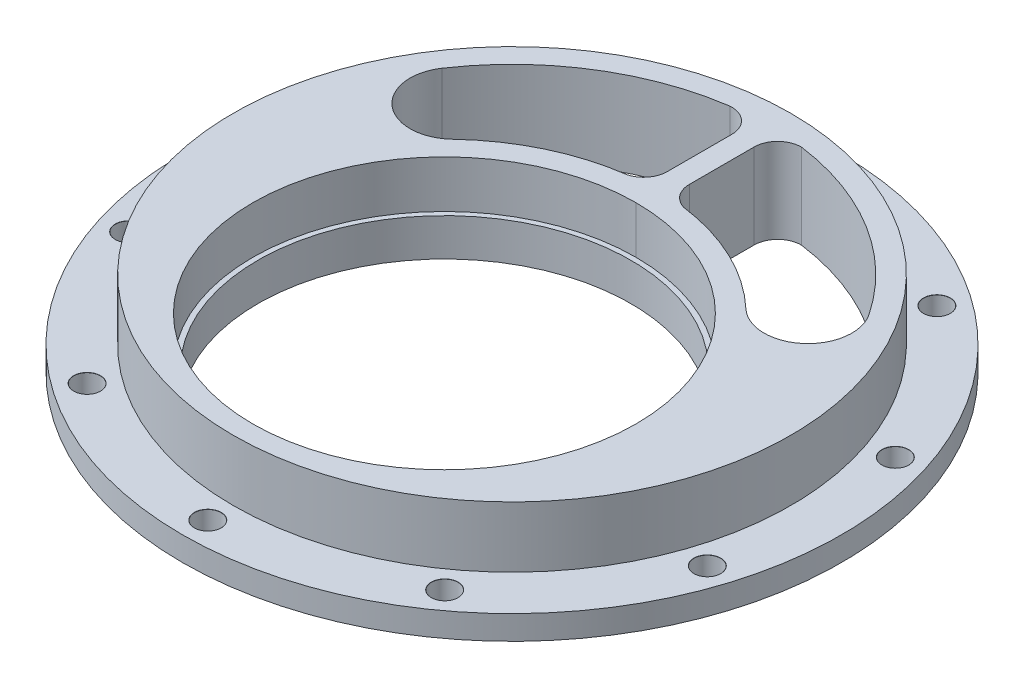
ISO-10303-21;
HEADER;
FILE_DESCRIPTION(('STEP AP214'),'2;1');
FILE_NAME('part.step','',(''),(''),'','','');
FILE_SCHEMA(('AUTOMOTIVE_DESIGN { 1 0 10303 214 1 1 1 1 }'));
ENDSEC;
DATA;
#1=APPLICATION_CONTEXT('core data for automotive mechanical design processes');
#2=APPLICATION_PROTOCOL_DEFINITION('international standard','automotive_design',2000,#1);
#3=PRODUCT_CONTEXT('',#1,'mechanical');
#4=PRODUCT('Part','Part','',(#3));
#5=PRODUCT_RELATED_PRODUCT_CATEGORY('part','',(#4));
#6=PRODUCT_DEFINITION_FORMATION('','',#4);
#7=PRODUCT_DEFINITION_CONTEXT('part definition',#1,'design');
#8=PRODUCT_DEFINITION('design','',#6,#7);
#9=PRODUCT_DEFINITION_SHAPE('','',#8);
#10=(LENGTH_UNIT() NAMED_UNIT(*) SI_UNIT(.MILLI.,.METRE.));
#11=(NAMED_UNIT(*) PLANE_ANGLE_UNIT() SI_UNIT($,.RADIAN.));
#12=(NAMED_UNIT(*) SI_UNIT($,.STERADIAN.) SOLID_ANGLE_UNIT());
#13=UNCERTAINTY_MEASURE_WITH_UNIT(LENGTH_MEASURE(1.E-05),#10,'distance_accuracy_value','');
#14=(GEOMETRIC_REPRESENTATION_CONTEXT(3) GLOBAL_UNCERTAINTY_ASSIGNED_CONTEXT((#13)) GLOBAL_UNIT_ASSIGNED_CONTEXT((#10,
#11,#12)) REPRESENTATION_CONTEXT('',''));
#15=CARTESIAN_POINT('',(0.,0.,0.));
#16=DIRECTION('',(0.,0.,1.));
#17=DIRECTION('',(1.,0.,0.));
#18=AXIS2_PLACEMENT_3D('',#15,#16,#17);
#19=CARTESIAN_POINT('',(0.,0.,12.7000000000001));
#20=DIRECTION('',(0.,1.,0.));
#21=DIRECTION('',(0.,0.,1.));
#22=AXIS2_PLACEMENT_3D('',#19,#20,#21);
#23=CYLINDRICAL_SURFACE('',#22,40.064000009);
#24=DIRECTION('',(0.,-1.,0.));
#25=VECTOR('',#24,1.);
#26=CARTESIAN_POINT('',(-5.36196665344637,41.1378035774203,-27.0035692391563));
#27=LINE('',#26,#25);
#28=CARTESIAN_POINT('',(-5.36196665344637,15.9512,-27.0035692391563));
#29=VERTEX_POINT('',#28);
#30=CARTESIAN_POINT('',(-5.36196665344637,0.,-27.0035692391563));
#31=VERTEX_POINT('',#30);
#32=EDGE_CURVE('E158',#29,#31,#27,.T.);
#33=ORIENTED_EDGE('',*,*,#32,.T.);
#34=CARTESIAN_POINT('',(0.,0.,12.7000000000001));
#35=DIRECTION('',(0.,-1.,0.));
#36=DIRECTION('',(0.,0.,-1.));
#37=AXIS2_PLACEMENT_3D('',#34,#35,#36);
#38=CIRCLE('',#37,40.064000009);
#39=CARTESIAN_POINT('',(-27.5686984222409,0.,-16.3704482941815));
#40=VERTEX_POINT('',#39);
#41=EDGE_CURVE('E172',#40,#31,#38,.T.);
#42=ORIENTED_EDGE('',*,*,#41,.F.);
#43=DIRECTION('',(0.,1.,0.));
#44=VECTOR('',#43,1.);
#45=CARTESIAN_POINT('',(-27.5686984222409,0.,-16.3704482941815));
#46=LINE('',#45,#44);
#47=CARTESIAN_POINT('',(-27.5686984222409,15.9512,-16.3704482941815));
#48=VERTEX_POINT('',#47);
#49=EDGE_CURVE('E256',#40,#48,#46,.T.);
#50=ORIENTED_EDGE('',*,*,#49,.T.);
#51=CARTESIAN_POINT('',(0.,15.9512,12.7000000000001));
#52=DIRECTION('',(0.,-1.,0.));
#53=DIRECTION('',(0.,0.,-1.));
#54=AXIS2_PLACEMENT_3D('',#51,#52,#53);
#55=CIRCLE('',#54,40.064000009);
#56=EDGE_CURVE('E175',#48,#29,#55,.T.);
#57=ORIENTED_EDGE('',*,*,#56,.T.);
#58=EDGE_LOOP('',(#33,#42,#50,#57));
#59=FACE_BOUND('',#58,.T.);
#60=ADVANCED_FACE('F51',(#59),#23,.T.);
#61=CARTESIAN_POINT('',(0.,0.,1.49186218934005E-13));
#62=DIRECTION('',(0.,1.,0.));
#63=DIRECTION('',(0.,0.,1.));
#64=AXIS2_PLACEMENT_3D('',#61,#62,#63);
#65=CYLINDRICAL_SURFACE('',#64,48.3235000000001);
#66=DIRECTION('',(0.,-1.,0.));
#67=VECTOR('',#66,1.);
#68=CARTESIAN_POINT('',(-6.90616370106759,41.1378035774203,-47.8274560810424));
#69=LINE('',#68,#67);
#70=CARTESIAN_POINT('',(-6.90616370106913,15.9512,-47.8274560810423));
#71=VERTEX_POINT('',#70);
#72=CARTESIAN_POINT('',(-6.90616370106892,0.,-47.8274560810423));
#73=VERTEX_POINT('',#72);
#74=EDGE_CURVE('E601',#71,#73,#69,.T.);
#75=ORIENTED_EDGE('',*,*,#74,.F.);
#76=CARTESIAN_POINT('',(0.,15.9512,1.49186218934005E-13));
#77=DIRECTION('',(0.,-1.,0.));
#78=DIRECTION('',(0.,0.,-1.));
#79=AXIS2_PLACEMENT_3D('',#76,#77,#78);
#80=CIRCLE('',#79,48.3235000000001);
#81=CARTESIAN_POINT('',(-40.0991521959871,15.9512,-26.9669917753736));
#82=VERTEX_POINT('',#81);
#83=EDGE_CURVE('E286',#82,#71,#80,.T.);
#84=ORIENTED_EDGE('',*,*,#83,.F.);
#85=DIRECTION('',(0.,1.,0.));
#86=VECTOR('',#85,1.);
#87=CARTESIAN_POINT('',(-40.0991521959871,0.,-26.9669917753736));
#88=LINE('',#87,#86);
#89=CARTESIAN_POINT('',(-40.0991521959871,0.,-26.9669917753736));
#90=VERTEX_POINT('',#89);
#91=EDGE_CURVE('E252',#90,#82,#88,.T.);
#92=ORIENTED_EDGE('',*,*,#91,.F.);
#93=CARTESIAN_POINT('',(0.,0.,1.49186218934005E-13));
#94=DIRECTION('',(0.,-1.,0.));
#95=DIRECTION('',(0.,0.,-1.));
#96=AXIS2_PLACEMENT_3D('',#93,#94,#95);
#97=CIRCLE('',#96,48.3235000000001);
#98=EDGE_CURVE('E76',#90,#73,#97,.T.);
#99=ORIENTED_EDGE('',*,*,#98,.T.);
#100=EDGE_LOOP('',(#75,#84,#92,#99));
#101=FACE_BOUND('',#100,.T.);
#102=ADVANCED_FACE('F528',(#101),#65,.F.);
#103=CARTESIAN_POINT('',(0.,7.0612,12.7));
#104=DIRECTION('',(0.,1.,0.));
#105=DIRECTION('',(0.,0.,1.));
#106=AXIS2_PLACEMENT_3D('',#103,#104,#105);
#107=CYLINDRICAL_SURFACE('',#106,36.000000009);
#108=CARTESIAN_POINT('',(0.,7.0612,12.7));
#109=DIRECTION('',(0.,1.,0.));
#110=DIRECTION('',(0.,0.,1.));
#111=AXIS2_PLACEMENT_3D('',#108,#109,#110);
#112=CIRCLE('',#111,36.000000009);
#113=CARTESIAN_POINT('',(0.,7.0612,-23.300000009));
#114=VERTEX_POINT('',#113);
#115=CARTESIAN_POINT('',(0.,7.0612,48.700000009));
#116=VERTEX_POINT('',#115);
#117=EDGE_CURVE('E306',#114,#116,#112,.T.);
#118=ORIENTED_EDGE('',*,*,#117,.F.);
#119=DIRECTION('',(0.,1.,0.));
#120=VECTOR('',#119,1.);
#121=CARTESIAN_POINT('',(0.,7.0612,-23.300000009));
#122=LINE('',#121,#120);
#123=CARTESIAN_POINT('',(0.,15.9512,-23.300000009));
#124=VERTEX_POINT('',#123);
#125=EDGE_CURVE('E12',#114,#124,#122,.T.);
#126=ORIENTED_EDGE('',*,*,#125,.T.);
#127=CARTESIAN_POINT('',(0.,15.9512,12.7));
#128=DIRECTION('',(0.,1.,0.));
#129=DIRECTION('',(0.,0.,1.));
#130=AXIS2_PLACEMENT_3D('',#127,#128,#129);
#131=CIRCLE('',#130,36.000000009);
#132=CARTESIAN_POINT('',(0.,15.9512,48.700000009));
#133=VERTEX_POINT('',#132);
#134=EDGE_CURVE('E307',#124,#133,#131,.T.);
#135=ORIENTED_EDGE('',*,*,#134,.T.);
#136=DIRECTION('',(0.,-1.,0.));
#137=VECTOR('',#136,1.);
#138=CARTESIAN_POINT('',(0.,7.0612,48.700000009));
#139=LINE('',#138,#137);
#140=EDGE_CURVE('E61',#133,#116,#139,.T.);
#141=ORIENTED_EDGE('',*,*,#140,.T.);
#142=EDGE_LOOP('',(#118,#126,#135,#141));
#143=FACE_BOUND('',#142,.T.);
#144=ADVANCED_FACE('F534',(#143),#107,.F.);
#145=CARTESIAN_POINT('',(0.,4.5212,12.7));
#146=DIRECTION('',(0.,-1.,0.));
#147=DIRECTION('',(0.,0.,-1.));
#148=AXIS2_PLACEMENT_3D('',#145,#146,#147);
#149=CYLINDRICAL_SURFACE('',#148,35.052);
#150=CARTESIAN_POINT('',(0.,0.,12.7));
#151=DIRECTION('',(0.,1.,0.));
#152=DIRECTION('',(0.,0.,1.));
#153=AXIS2_PLACEMENT_3D('',#150,#151,#152);
#154=CIRCLE('',#153,35.052);
#155=CARTESIAN_POINT('',(0.,0.,47.752));
#156=VERTEX_POINT('',#155);
#157=EDGE_CURVE('E386',#156,#156,#154,.T.);
#158=ORIENTED_EDGE('',*,*,#157,.F.);
#159=EDGE_LOOP('',(#158));
#160=FACE_BOUND('',#159,.T.);
#161=CARTESIAN_POINT('',(0.,7.0612,12.7));
#162=DIRECTION('',(0.,1.,0.));
#163=DIRECTION('',(0.,0.,1.));
#164=AXIS2_PLACEMENT_3D('',#161,#162,#163);
#165=CIRCLE('',#164,35.052);
#166=CARTESIAN_POINT('',(0.,7.0612,47.752));
#167=VERTEX_POINT('',#166);
#168=EDGE_CURVE('E399',#167,#167,#165,.T.);
#169=ORIENTED_EDGE('',*,*,#168,.T.);
#170=EDGE_LOOP('',(#169));
#171=FACE_BOUND('',#170,.T.);
#172=ADVANCED_FACE('F53',(#160,#171),#149,.F.);
#173=CARTESIAN_POINT('',(0.,4.5212,0.));
#174=DIRECTION('',(0.,-1.,0.));
#175=DIRECTION('',(0.,0.,-1.));
#176=AXIS2_PLACEMENT_3D('',#173,#174,#175);
#177=CYLINDRICAL_SURFACE('',#176,61.9125);
#178=CARTESIAN_POINT('',(0.,4.5212,0.));
#179=DIRECTION('',(0.,1.,0.));
#180=DIRECTION('',(0.,0.,1.));
#181=AXIS2_PLACEMENT_3D('',#178,#179,#180);
#182=CIRCLE('',#181,61.9125);
#183=CARTESIAN_POINT('',(0.,4.5212,61.9125));
#184=VERTEX_POINT('',#183);
#185=EDGE_CURVE('E393',#184,#184,#182,.T.);
#186=ORIENTED_EDGE('',*,*,#185,.F.);
#187=EDGE_LOOP('',(#186));
#188=FACE_BOUND('',#187,.T.);
#189=CARTESIAN_POINT('',(0.,0.,0.));
#190=DIRECTION('',(0.,1.,0.));
#191=DIRECTION('',(0.,0.,1.));
#192=AXIS2_PLACEMENT_3D('',#189,#190,#191);
#193=CIRCLE('',#192,61.9125);
#194=CARTESIAN_POINT('',(0.,0.,61.9125));
#195=VERTEX_POINT('',#194);
#196=EDGE_CURVE('E392',#195,#195,#193,.T.);
#197=ORIENTED_EDGE('',*,*,#196,.T.);
#198=EDGE_LOOP('',(#197));
#199=FACE_BOUND('',#198,.T.);
#200=ADVANCED_FACE('F728',(#188,#199),#177,.T.);
#201=CARTESIAN_POINT('',(0.,4.5212,0.));
#202=DIRECTION('',(0.,1.,0.));
#203=DIRECTION('',(0.,0.,1.));
#204=AXIS2_PLACEMENT_3D('',#201,#202,#203);
#205=PLANE('',#204);
#206=CARTESIAN_POINT('',(33.5919271685142,4.5212,-46.2353212285287));
#207=DIRECTION('',(0.,1.,0.));
#208=DIRECTION('',(0.,0.,1.));
#209=AXIS2_PLACEMENT_3D('',#206,#207,#208);
#210=CIRCLE('',#209,2.525);
#211=CARTESIAN_POINT('',(33.5919271685142,4.5212,-43.7103212285287));
#212=VERTEX_POINT('',#211);
#213=EDGE_CURVE('E268',#212,#212,#210,.T.);
#214=ORIENTED_EDGE('',*,*,#213,.F.);
#215=EDGE_LOOP('',(#214));
#216=FACE_BOUND('',#215,.T.);
#217=CARTESIAN_POINT('',(54.3528799062678,4.5212,-17.6603212285289));
#218=DIRECTION('',(0.,1.,0.));
#219=DIRECTION('',(0.,0.,1.));
#220=AXIS2_PLACEMENT_3D('',#217,#218,#219);
#221=CIRCLE('',#220,2.525);
#222=CARTESIAN_POINT('',(54.3528799062678,4.5212,-15.1353212285289));
#223=VERTEX_POINT('',#222);
#224=EDGE_CURVE('E1140',#223,#223,#221,.T.);
#225=ORIENTED_EDGE('',*,*,#224,.F.);
#226=EDGE_LOOP('',(#225));
#227=FACE_BOUND('',#226,.T.);
#228=CARTESIAN_POINT('',(54.3528799062682,4.5212,17.6603212285277));
#229=DIRECTION('',(0.,1.,0.));
#230=DIRECTION('',(0.,0.,1.));
#231=AXIS2_PLACEMENT_3D('',#228,#229,#230);
#232=CIRCLE('',#231,2.525);
#233=CARTESIAN_POINT('',(54.3528799062682,4.5212,20.1853212285277));
#234=VERTEX_POINT('',#233);
#235=EDGE_CURVE('E372',#234,#234,#232,.T.);
#236=ORIENTED_EDGE('',*,*,#235,.F.);
#237=EDGE_LOOP('',(#236));
#238=FACE_BOUND('',#237,.T.);
#239=CARTESIAN_POINT('',(33.5919271685152,4.5212,46.2353212285279));
#240=DIRECTION('',(0.,1.,0.));
#241=DIRECTION('',(0.,0.,1.));
#242=AXIS2_PLACEMENT_3D('',#239,#240,#241);
#243=CIRCLE('',#242,2.525);
#244=CARTESIAN_POINT('',(33.5919271685152,4.5212,48.7603212285279));
#245=VERTEX_POINT('',#244);
#246=EDGE_CURVE('E350',#245,#245,#243,.T.);
#247=ORIENTED_EDGE('',*,*,#246,.F.);
#248=EDGE_LOOP('',(#247));
#249=FACE_BOUND('',#248,.T.);
#250=CARTESIAN_POINT('',(0.,4.5212,57.15));
#251=DIRECTION('',(0.,1.,0.));
#252=DIRECTION('',(0.,0.,1.));
#253=AXIS2_PLACEMENT_3D('',#250,#251,#252);
#254=CIRCLE('',#253,2.525);
#255=CARTESIAN_POINT('',(0.,4.5212,59.675));
#256=VERTEX_POINT('',#255);
#257=EDGE_CURVE('E326',#256,#256,#254,.T.);
#258=ORIENTED_EDGE('',*,*,#257,.F.);
#259=EDGE_LOOP('',(#258));
#260=FACE_BOUND('',#259,.T.);
#261=CARTESIAN_POINT('',(-33.5919271685146,4.5212,46.2353212285284));
#262=DIRECTION('',(0.,1.,0.));
#263=DIRECTION('',(0.,0.,1.));
#264=AXIS2_PLACEMENT_3D('',#261,#262,#263);
#265=CIRCLE('',#264,2.525);
#266=CARTESIAN_POINT('',(-33.5919271685146,4.5212,48.7603212285284));
#267=VERTEX_POINT('',#266);
#268=EDGE_CURVE('E478',#267,#267,#265,.T.);
#269=ORIENTED_EDGE('',*,*,#268,.F.);
#270=EDGE_LOOP('',(#269));
#271=FACE_BOUND('',#270,.T.);
#272=CARTESIAN_POINT('',(-54.352879906268,4.5212,17.6603212285285));
#273=DIRECTION('',(0.,1.,0.));
#274=DIRECTION('',(0.,0.,1.));
#275=AXIS2_PLACEMENT_3D('',#272,#273,#274);
#276=CIRCLE('',#275,2.525);
#277=CARTESIAN_POINT('',(-54.352879906268,4.5212,20.1853212285285));
#278=VERTEX_POINT('',#277);
#279=EDGE_CURVE('E496',#278,#278,#276,.T.);
#280=ORIENTED_EDGE('',*,*,#279,.F.);
#281=EDGE_LOOP('',(#280));
#282=FACE_BOUND('',#281,.T.);
#283=CARTESIAN_POINT('',(-54.3528799062681,4.5212,-17.6603212285281));
#284=DIRECTION('',(0.,1.,0.));
#285=DIRECTION('',(0.,0.,1.));
#286=AXIS2_PLACEMENT_3D('',#283,#284,#285);
#287=CIRCLE('',#286,2.525);
#288=CARTESIAN_POINT('',(-54.3528799062681,4.5212,-15.1353212285281));
#289=VERTEX_POINT('',#288);
#290=EDGE_CURVE('E464',#289,#289,#287,.T.);
#291=ORIENTED_EDGE('',*,*,#290,.F.);
#292=EDGE_LOOP('',(#291));
#293=FACE_BOUND('',#292,.T.);
#294=CARTESIAN_POINT('',(-33.5919271685149,4.5212,-46.2353212285282));
#295=DIRECTION('',(0.,1.,0.));
#296=DIRECTION('',(0.,0.,1.));
#297=AXIS2_PLACEMENT_3D('',#294,#295,#296);
#298=CIRCLE('',#297,2.525);
#299=CARTESIAN_POINT('',(-33.5919271685149,4.5212,-43.7103212285282));
#300=VERTEX_POINT('',#299);
#301=EDGE_CURVE('E447',#300,#300,#298,.T.);
#302=ORIENTED_EDGE('',*,*,#301,.F.);
#303=EDGE_LOOP('',(#302));
#304=FACE_BOUND('',#303,.T.);
#305=CARTESIAN_POINT('',(0.,4.5212,-57.15));
#306=DIRECTION('',(0.,1.,0.));
#307=DIRECTION('',(0.,0.,1.));
#308=AXIS2_PLACEMENT_3D('',#305,#306,#307);
#309=CIRCLE('',#308,2.525);
#310=CARTESIAN_POINT('',(0.,4.5212,-54.625));
#311=VERTEX_POINT('',#310);
#312=EDGE_CURVE('E424',#311,#311,#309,.T.);
#313=ORIENTED_EDGE('',*,*,#312,.F.);
#314=EDGE_LOOP('',(#313));
#315=FACE_BOUND('',#314,.T.);
#316=CARTESIAN_POINT('',(0.,4.5212,0.));
#317=DIRECTION('',(0.,1.,0.));
#318=DIRECTION('',(0.,0.,1.));
#319=AXIS2_PLACEMENT_3D('',#316,#317,#318);
#320=CIRCLE('',#319,52.3875);
#321=CARTESIAN_POINT('',(0.,4.5212,52.3875));
#322=VERTEX_POINT('',#321);
#323=EDGE_CURVE('E406',#322,#322,#320,.T.);
#324=ORIENTED_EDGE('',*,*,#323,.F.);
#325=EDGE_LOOP('',(#324));
#326=FACE_BOUND('',#325,.T.);
#327=ORIENTED_EDGE('',*,*,#185,.T.);
#328=EDGE_LOOP('',(#327));
#329=FACE_BOUND('',#328,.T.);
#330=ADVANCED_FACE('F730',(#216,#227,#238,#249,#260,#271,#282,#293,#304,#315,#326,#329),#205,.T.);
#331=CARTESIAN_POINT('',(0.,0.,0.));
#332=DIRECTION('',(0.,1.,0.));
#333=DIRECTION('',(0.,0.,1.));
#334=AXIS2_PLACEMENT_3D('',#331,#332,#333);
#335=PLANE('',#334);
#336=ORIENTED_EDGE('',*,*,#41,.T.);
#337=CARTESIAN_POINT('',(-6.56213301995788,0.,-31.2834787817395));
#338=DIRECTION('',(0.,1.,0.));
#339=DIRECTION('',(0.,0.,1.));
#340=AXIS2_PLACEMENT_3D('',#337,#338,#339);
#341=CIRCLE('',#340,4.445);
#342=CARTESIAN_POINT('',(-2.11713301995788,0.,-31.2834787817395));
#343=VERTEX_POINT('',#342);
#344=EDGE_CURVE('E154',#31,#343,#341,.T.);
#345=ORIENTED_EDGE('',*,*,#344,.T.);
#346=DIRECTION('',(0.,0.,1.));
#347=VECTOR('',#346,1.);
#348=CARTESIAN_POINT('',(-2.11713301995788,0.,0.));
#349=LINE('',#348,#347);
#350=CARTESIAN_POINT('',(-2.1171330199578,0.,-43.3957895897036));
#351=VERTEX_POINT('',#350);
#352=EDGE_CURVE('E168',#351,#343,#349,.T.);
#353=ORIENTED_EDGE('',*,*,#352,.F.);
#354=CARTESIAN_POINT('',(-6.56213301995788,0.,-43.3957895897036));
#355=DIRECTION('',(0.,1.,0.));
#356=DIRECTION('',(0.,0.,1.));
#357=AXIS2_PLACEMENT_3D('',#354,#355,#356);
#358=CIRCLE('',#357,4.44500000000008);
#359=EDGE_CURVE('E579',#73,#351,#358,.F.);
#360=ORIENTED_EDGE('',*,*,#359,.F.);
#361=ORIENTED_EDGE('',*,*,#98,.F.);
#362=CARTESIAN_POINT('',(-33.2490999154636,0.,-22.3602783314859));
#363=DIRECTION('',(0.,1.,0.));
#364=DIRECTION('',(0.,0.,1.));
#365=AXIS2_PLACEMENT_3D('',#362,#363,#364);
#366=CIRCLE('',#365,8.25500000000001);
#367=EDGE_CURVE('E181',#90,#40,#366,.T.);
#368=ORIENTED_EDGE('',*,*,#367,.T.);
#369=EDGE_LOOP('',(#336,#345,#353,#360,#361,#368));
#370=FACE_BOUND('',#369,.T.);
#371=CARTESIAN_POINT('',(6.47699999999742,0.,-31.2909667703814));
#372=DIRECTION('',(0.,1.,0.));
#373=DIRECTION('',(0.,0.,1.));
#374=AXIS2_PLACEMENT_3D('',#371,#372,#373);
#375=CIRCLE('',#374,4.445);
#376=CARTESIAN_POINT('',(5.25092409611565,0.,-27.0184074813931));
#377=VERTEX_POINT('',#376);
#378=CARTESIAN_POINT('',(2.03199999999742,0.,-31.2909667703814));
#379=VERTEX_POINT('',#378);
#380=EDGE_CURVE('E68',#377,#379,#375,.F.);
#381=ORIENTED_EDGE('',*,*,#380,.F.);
#382=CARTESIAN_POINT('',(27.5686984222409,0.,-16.3704482941815));
#383=VERTEX_POINT('',#382);
#384=EDGE_CURVE('E184',#377,#383,#38,.T.);
#385=ORIENTED_EDGE('',*,*,#384,.T.);
#386=CARTESIAN_POINT('',(33.2490999154636,0.,-22.3602783314859));
#387=DIRECTION('',(0.,1.,0.));
#388=DIRECTION('',(0.,0.,1.));
#389=AXIS2_PLACEMENT_3D('',#386,#387,#388);
#390=CIRCLE('',#389,8.25500000000001);
#391=CARTESIAN_POINT('',(40.099152195987,0.,-26.9669917753736));
#392=VERTEX_POINT('',#391);
#393=EDGE_CURVE('E183',#383,#392,#390,.T.);
#394=ORIENTED_EDGE('',*,*,#393,.T.);
#395=CARTESIAN_POINT('',(6.50374129930266,0.,-47.8838386239212));
#396=VERTEX_POINT('',#395);
#397=EDGE_CURVE('E189',#396,#392,#97,.T.);
#398=ORIENTED_EDGE('',*,*,#397,.F.);
#399=CARTESIAN_POINT('',(6.47699999999742,0.,-43.4389190630167));
#400=DIRECTION('',(0.,1.,0.));
#401=DIRECTION('',(0.,0.,1.));
#402=AXIS2_PLACEMENT_3D('',#399,#400,#401);
#403=CIRCLE('',#402,4.44500000000008);
#404=CARTESIAN_POINT('',(2.03199999999742,0.,-43.4389190630167));
#405=VERTEX_POINT('',#404);
#406=EDGE_CURVE('E576',#405,#396,#403,.F.);
#407=ORIENTED_EDGE('',*,*,#406,.F.);
#408=DIRECTION('',(0.,0.,1.));
#409=VECTOR('',#408,1.);
#410=CARTESIAN_POINT('',(2.03199999999742,0.,0.));
#411=LINE('',#410,#409);
#412=EDGE_CURVE('E570',#405,#379,#411,.T.);
#413=ORIENTED_EDGE('',*,*,#412,.T.);
#414=EDGE_LOOP('',(#381,#385,#394,#398,#407,#413));
#415=FACE_BOUND('',#414,.T.);
#416=CARTESIAN_POINT('',(33.5919271685142,0.,-46.2353212285287));
#417=DIRECTION('',(0.,1.,0.));
#418=DIRECTION('',(0.,0.,1.));
#419=AXIS2_PLACEMENT_3D('',#416,#417,#418);
#420=CIRCLE('',#419,2.5);
#421=CARTESIAN_POINT('',(33.5919271685142,0.,-43.7353212285287));
#422=VERTEX_POINT('',#421);
#423=EDGE_CURVE('E1135',#422,#422,#420,.T.);
#424=ORIENTED_EDGE('',*,*,#423,.T.);
#425=EDGE_LOOP('',(#424));
#426=FACE_BOUND('',#425,.T.);
#427=CARTESIAN_POINT('',(54.3528799062678,0.,-17.6603212285289));
#428=DIRECTION('',(0.,1.,0.));
#429=DIRECTION('',(0.,0.,1.));
#430=AXIS2_PLACEMENT_3D('',#427,#428,#429);
#431=CIRCLE('',#430,2.5);
#432=CARTESIAN_POINT('',(54.3528799062678,0.,-15.1603212285289));
#433=VERTEX_POINT('',#432);
#434=EDGE_CURVE('E376',#433,#433,#431,.T.);
#435=ORIENTED_EDGE('',*,*,#434,.T.);
#436=EDGE_LOOP('',(#435));
#437=FACE_BOUND('',#436,.T.);
#438=CARTESIAN_POINT('',(54.3528799062682,0.,17.6603212285277));
#439=DIRECTION('',(0.,1.,0.));
#440=DIRECTION('',(0.,0.,1.));
#441=AXIS2_PLACEMENT_3D('',#438,#439,#440);
#442=CIRCLE('',#441,2.5);
#443=CARTESIAN_POINT('',(54.3528799062682,0.,20.1603212285277));
#444=VERTEX_POINT('',#443);
#445=EDGE_CURVE('E355',#444,#444,#442,.T.);
#446=ORIENTED_EDGE('',*,*,#445,.T.);
#447=EDGE_LOOP('',(#446));
#448=FACE_BOUND('',#447,.T.);
#449=CARTESIAN_POINT('',(33.5919271685152,0.,46.2353212285279));
#450=DIRECTION('',(0.,1.,0.));
#451=DIRECTION('',(0.,0.,1.));
#452=AXIS2_PLACEMENT_3D('',#449,#450,#451);
#453=CIRCLE('',#452,2.5);
#454=CARTESIAN_POINT('',(33.5919271685152,0.,48.7353212285279));
#455=VERTEX_POINT('',#454);
#456=EDGE_CURVE('E332',#455,#455,#453,.T.);
#457=ORIENTED_EDGE('',*,*,#456,.T.);
#458=EDGE_LOOP('',(#457));
#459=FACE_BOUND('',#458,.T.);
#460=CARTESIAN_POINT('',(0.,0.,57.15));
#461=DIRECTION('',(0.,1.,0.));
#462=DIRECTION('',(0.,0.,1.));
#463=AXIS2_PLACEMENT_3D('',#460,#461,#462);
#464=CIRCLE('',#463,2.5);
#465=CARTESIAN_POINT('',(0.,0.,59.65));
#466=VERTEX_POINT('',#465);
#467=EDGE_CURVE('E473',#466,#466,#464,.T.);
#468=ORIENTED_EDGE('',*,*,#467,.T.);
#469=EDGE_LOOP('',(#468));
#470=FACE_BOUND('',#469,.T.);
#471=CARTESIAN_POINT('',(-33.5919271685146,0.,46.2353212285284));
#472=DIRECTION('',(0.,1.,0.));
#473=DIRECTION('',(0.,0.,1.));
#474=AXIS2_PLACEMENT_3D('',#471,#472,#473);
#475=CIRCLE('',#474,2.5);
#476=CARTESIAN_POINT('',(-33.5919271685146,0.,48.7353212285284));
#477=VERTEX_POINT('',#476);
#478=EDGE_CURVE('E491',#477,#477,#475,.T.);
#479=ORIENTED_EDGE('',*,*,#478,.T.);
#480=EDGE_LOOP('',(#479));
#481=FACE_BOUND('',#480,.T.);
#482=CARTESIAN_POINT('',(-54.352879906268,0.,17.6603212285285));
#483=DIRECTION('',(0.,1.,0.));
#484=DIRECTION('',(0.,0.,1.));
#485=AXIS2_PLACEMENT_3D('',#482,#483,#484);
#486=CIRCLE('',#485,2.5);
#487=CARTESIAN_POINT('',(-54.352879906268,0.,20.1603212285285));
#488=VERTEX_POINT('',#487);
#489=EDGE_CURVE('E468',#488,#488,#486,.T.);
#490=ORIENTED_EDGE('',*,*,#489,.T.);
#491=EDGE_LOOP('',(#490));
#492=FACE_BOUND('',#491,.T.);
#493=CARTESIAN_POINT('',(-54.3528799062681,0.,-17.6603212285281));
#494=DIRECTION('',(0.,1.,0.));
#495=DIRECTION('',(0.,0.,1.));
#496=AXIS2_PLACEMENT_3D('',#493,#494,#495);
#497=CIRCLE('',#496,2.5);
#498=CARTESIAN_POINT('',(-54.3528799062681,0.,-15.1603212285281));
#499=VERTEX_POINT('',#498);
#500=EDGE_CURVE('E452',#499,#499,#497,.T.);
#501=ORIENTED_EDGE('',*,*,#500,.T.);
#502=EDGE_LOOP('',(#501));
#503=FACE_BOUND('',#502,.T.);
#504=CARTESIAN_POINT('',(-33.5919271685149,0.,-46.2353212285282));
#505=DIRECTION('',(0.,1.,0.));
#506=DIRECTION('',(0.,0.,1.));
#507=AXIS2_PLACEMENT_3D('',#504,#505,#506);
#508=CIRCLE('',#507,2.5);
#509=CARTESIAN_POINT('',(-33.5919271685149,0.,-43.7353212285282));
#510=VERTEX_POINT('',#509);
#511=EDGE_CURVE('E430',#510,#510,#508,.T.);
#512=ORIENTED_EDGE('',*,*,#511,.T.);
#513=EDGE_LOOP('',(#512));
#514=FACE_BOUND('',#513,.T.);
#515=CARTESIAN_POINT('',(0.,0.,-57.15));
#516=DIRECTION('',(0.,1.,0.));
#517=DIRECTION('',(0.,0.,1.));
#518=AXIS2_PLACEMENT_3D('',#515,#516,#517);
#519=CIRCLE('',#518,2.5);
#520=CARTESIAN_POINT('',(0.,0.,-54.65));
#521=VERTEX_POINT('',#520);
#522=EDGE_CURVE('E1015',#521,#521,#519,.T.);
#523=ORIENTED_EDGE('',*,*,#522,.T.);
#524=EDGE_LOOP('',(#523));
#525=FACE_BOUND('',#524,.T.);
#526=ORIENTED_EDGE('',*,*,#157,.T.);
#527=EDGE_LOOP('',(#526));
#528=FACE_BOUND('',#527,.T.);
#529=ORIENTED_EDGE('',*,*,#196,.F.);
#530=EDGE_LOOP('',(#529));
#531=FACE_BOUND('',#530,.T.);
#532=ADVANCED_FACE('F179',(#370,#415,#426,#437,#448,#459,#470,#481,#492,#503,#514,#525,#528,
#531),#335,.F.);
#533=CARTESIAN_POINT('',(0.,15.9512,0.));
#534=DIRECTION('',(0.,1.,0.));
#535=DIRECTION('',(0.,0.,1.));
#536=AXIS2_PLACEMENT_3D('',#533,#534,#535);
#537=PLANE('',#536);
#538=CARTESIAN_POINT('',(5.25092409611575,15.9512,-27.0184074813931));
#539=VERTEX_POINT('',#538);
#540=CARTESIAN_POINT('',(27.5686984222409,15.9512,-16.3704482941815));
#541=VERTEX_POINT('',#540);
#542=EDGE_CURVE('E1202',#539,#541,#55,.T.);
#543=ORIENTED_EDGE('',*,*,#542,.F.);
#544=CARTESIAN_POINT('',(6.47699999999742,15.9512,-31.2909667703814));
#545=DIRECTION('',(0.,1.,0.));
#546=DIRECTION('',(0.,0.,1.));
#547=AXIS2_PLACEMENT_3D('',#544,#545,#546);
#548=CIRCLE('',#547,4.445);
#549=CARTESIAN_POINT('',(2.03199999999742,15.9512,-31.2909667703814));
#550=VERTEX_POINT('',#549);
#551=EDGE_CURVE('E213',#550,#539,#548,.T.);
#552=ORIENTED_EDGE('',*,*,#551,.F.);
#553=DIRECTION('',(0.,0.,-1.));
#554=VECTOR('',#553,1.);
#555=CARTESIAN_POINT('',(2.03199999999742,15.9512,0.));
#556=LINE('',#555,#554);
#557=CARTESIAN_POINT('',(2.03199999999734,15.9512,-43.4389190630167));
#558=VERTEX_POINT('',#557);
#559=EDGE_CURVE('E617',#550,#558,#556,.T.);
#560=ORIENTED_EDGE('',*,*,#559,.T.);
#561=CARTESIAN_POINT('',(6.47699999999742,15.9512,-43.4389190630167));
#562=DIRECTION('',(0.,1.,0.));
#563=DIRECTION('',(0.,0.,1.));
#564=AXIS2_PLACEMENT_3D('',#561,#562,#563);
#565=CIRCLE('',#564,4.44500000000008);
#566=CARTESIAN_POINT('',(6.50374129930344,15.9512,-47.8838386239212));
#567=VERTEX_POINT('',#566);
#568=EDGE_CURVE('E224',#567,#558,#565,.T.);
#569=ORIENTED_EDGE('',*,*,#568,.F.);
#570=CARTESIAN_POINT('',(40.099152195987,15.9512,-26.9669917753736));
#571=VERTEX_POINT('',#570);
#572=EDGE_CURVE('E291',#567,#571,#80,.T.);
#573=ORIENTED_EDGE('',*,*,#572,.T.);
#574=CARTESIAN_POINT('',(33.2490999154636,15.9512,-22.3602783314859));
#575=DIRECTION('',(0.,1.,0.));
#576=DIRECTION('',(0.,0.,1.));
#577=AXIS2_PLACEMENT_3D('',#574,#575,#576);
#578=CIRCLE('',#577,8.25500000000001);
#579=EDGE_CURVE('E292',#541,#571,#578,.T.);
#580=ORIENTED_EDGE('',*,*,#579,.F.);
#581=EDGE_LOOP('',(#543,#552,#560,#569,#573,#580));
#582=FACE_BOUND('',#581,.T.);
#583=ORIENTED_EDGE('',*,*,#56,.F.);
#584=CARTESIAN_POINT('',(-33.2490999154636,15.9512,-22.3602783314859));
#585=DIRECTION('',(0.,1.,0.));
#586=DIRECTION('',(0.,0.,1.));
#587=AXIS2_PLACEMENT_3D('',#584,#585,#586);
#588=CIRCLE('',#587,8.25500000000001);
#589=EDGE_CURVE('E191',#82,#48,#588,.T.);
#590=ORIENTED_EDGE('',*,*,#589,.F.);
#591=ORIENTED_EDGE('',*,*,#83,.T.);
#592=CARTESIAN_POINT('',(-6.56213301995788,15.9512,-43.3957895897036));
#593=DIRECTION('',(0.,1.,0.));
#594=DIRECTION('',(0.,0.,1.));
#595=AXIS2_PLACEMENT_3D('',#592,#593,#594);
#596=CIRCLE('',#595,4.44500000000008);
#597=CARTESIAN_POINT('',(-2.11713301995788,15.9512,-43.3957895897036));
#598=VERTEX_POINT('',#597);
#599=EDGE_CURVE('E599',#598,#71,#596,.T.);
#600=ORIENTED_EDGE('',*,*,#599,.F.);
#601=DIRECTION('',(0.,0.,-1.));
#602=VECTOR('',#601,1.);
#603=CARTESIAN_POINT('',(-2.11713301995788,15.9512,0.));
#604=LINE('',#603,#602);
#605=CARTESIAN_POINT('',(-2.11713301995788,15.9512,-31.2834787817395));
#606=VERTEX_POINT('',#605);
#607=EDGE_CURVE('E600',#606,#598,#604,.T.);
#608=ORIENTED_EDGE('',*,*,#607,.F.);
#609=CARTESIAN_POINT('',(-6.56213301995788,15.9512,-31.2834787817395));
#610=DIRECTION('',(0.,1.,0.));
#611=DIRECTION('',(0.,0.,1.));
#612=AXIS2_PLACEMENT_3D('',#609,#610,#611);
#613=CIRCLE('',#612,4.445);
#614=EDGE_CURVE('E167',#606,#29,#613,.F.);
#615=ORIENTED_EDGE('',*,*,#614,.T.);
#616=EDGE_LOOP('',(#583,#590,#591,#600,#608,#615));
#617=FACE_BOUND('',#616,.T.);
#618=EDGE_CURVE('E301',#133,#124,#131,.T.);
#619=ORIENTED_EDGE('',*,*,#618,.F.);
#620=ORIENTED_EDGE('',*,*,#134,.F.);
#621=EDGE_LOOP('',(#619,#620));
#622=FACE_BOUND('',#621,.T.);
#623=CARTESIAN_POINT('',(0.,15.9512,0.));
#624=DIRECTION('',(0.,1.,0.));
#625=DIRECTION('',(0.,0.,1.));
#626=AXIS2_PLACEMENT_3D('',#623,#624,#625);
#627=CIRCLE('',#626,52.3875);
#628=CARTESIAN_POINT('',(0.,15.9512,52.3875));
#629=VERTEX_POINT('',#628);
#630=EDGE_CURVE('E311',#629,#629,#627,.T.);
#631=ORIENTED_EDGE('',*,*,#630,.T.);
#632=EDGE_LOOP('',(#631));
#633=FACE_BOUND('',#632,.T.);
#634=ADVANCED_FACE('F628',(#582,#617,#622,#633),#537,.T.);
#635=CARTESIAN_POINT('',(0.,15.9512,0.));
#636=DIRECTION('',(0.,-1.,0.));
#637=DIRECTION('',(0.,0.,-1.));
#638=AXIS2_PLACEMENT_3D('',#635,#636,#637);
#639=CYLINDRICAL_SURFACE('',#638,52.3875);
#640=ORIENTED_EDGE('',*,*,#630,.F.);
#641=EDGE_LOOP('',(#640));
#642=FACE_BOUND('',#641,.T.);
#643=ORIENTED_EDGE('',*,*,#323,.T.);
#644=EDGE_LOOP('',(#643));
#645=FACE_BOUND('',#644,.T.);
#646=ADVANCED_FACE('F716',(#642,#645),#639,.T.);
#647=ORIENTED_EDGE('',*,*,#125,.F.);
#648=EDGE_CURVE('E308',#116,#114,#112,.T.);
#649=ORIENTED_EDGE('',*,*,#648,.F.);
#650=ORIENTED_EDGE('',*,*,#140,.F.);
#651=ORIENTED_EDGE('',*,*,#618,.T.);
#652=EDGE_LOOP('',(#647,#649,#650,#651));
#653=FACE_BOUND('',#652,.T.);
#654=ADVANCED_FACE('F706',(#653),#107,.F.);
#655=CARTESIAN_POINT('',(0.,7.0612,12.7));
#656=DIRECTION('',(0.,1.,0.));
#657=DIRECTION('',(0.,0.,1.));
#658=AXIS2_PLACEMENT_3D('',#655,#656,#657);
#659=PLANE('',#658);
#660=ORIENTED_EDGE('',*,*,#168,.F.);
#661=EDGE_LOOP('',(#660));
#662=FACE_BOUND('',#661,.T.);
#663=ORIENTED_EDGE('',*,*,#648,.T.);
#664=ORIENTED_EDGE('',*,*,#117,.T.);
#665=EDGE_LOOP('',(#663,#664));
#666=FACE_BOUND('',#665,.T.);
#667=ADVANCED_FACE('F701',(#662,#666),#659,.T.);
#668=CARTESIAN_POINT('',(0.,4.5212,-57.15));
#669=DIRECTION('',(0.,1.,0.));
#670=DIRECTION('',(0.,0.,1.));
#671=AXIS2_PLACEMENT_3D('',#668,#669,#670);
#672=CYLINDRICAL_SURFACE('',#671,2.5);
#673=ORIENTED_EDGE('',*,*,#522,.F.);
#674=EDGE_LOOP('',(#673));
#675=FACE_BOUND('',#674,.T.);
#676=CARTESIAN_POINT('',(0.,4.4962,-57.15));
#677=DIRECTION('',(0.,1.,0.));
#678=DIRECTION('',(0.,0.,1.));
#679=AXIS2_PLACEMENT_3D('',#676,#677,#678);
#680=CIRCLE('',#679,2.5);
#681=CARTESIAN_POINT('',(0.,4.4962,-54.65));
#682=VERTEX_POINT('',#681);
#683=EDGE_CURVE('E429',#682,#682,#680,.T.);
#684=ORIENTED_EDGE('',*,*,#683,.T.);
#685=EDGE_LOOP('',(#684));
#686=FACE_BOUND('',#685,.T.);
#687=ADVANCED_FACE('F705',(#675,#686),#672,.F.);
#688=CARTESIAN_POINT('',(0.,4.5212,-57.15));
#689=DIRECTION('',(0.,1.,0.));
#690=DIRECTION('',(0.,0.,1.));
#691=AXIS2_PLACEMENT_3D('',#688,#689,#690);
#692=CONICAL_SURFACE('',#691,2.525,0.785398163397492);
#693=ORIENTED_EDGE('',*,*,#683,.F.);
#694=EDGE_LOOP('',(#693));
#695=FACE_BOUND('',#694,.T.);
#696=ORIENTED_EDGE('',*,*,#312,.T.);
#697=EDGE_LOOP('',(#696));
#698=FACE_BOUND('',#697,.T.);
#699=ADVANCED_FACE('F817',(#695,#698),#692,.F.);
#700=CARTESIAN_POINT('',(-33.5919271685149,4.5212,-46.2353212285282));
#701=DIRECTION('',(0.,1.,0.));
#702=DIRECTION('',(0.,0.,1.));
#703=AXIS2_PLACEMENT_3D('',#700,#701,#702);
#704=CYLINDRICAL_SURFACE('',#703,2.5);
#705=ORIENTED_EDGE('',*,*,#511,.F.);
#706=EDGE_LOOP('',(#705));
#707=FACE_BOUND('',#706,.T.);
#708=CARTESIAN_POINT('',(-33.5919271685149,4.4962,-46.2353212285282));
#709=DIRECTION('',(0.,1.,0.));
#710=DIRECTION('',(0.,0.,1.));
#711=AXIS2_PLACEMENT_3D('',#708,#709,#710);
#712=CIRCLE('',#711,2.5);
#713=CARTESIAN_POINT('',(-33.5919271685149,4.4962,-43.7353212285282));
#714=VERTEX_POINT('',#713);
#715=EDGE_CURVE('E443',#714,#714,#712,.T.);
#716=ORIENTED_EDGE('',*,*,#715,.T.);
#717=EDGE_LOOP('',(#716));
#718=FACE_BOUND('',#717,.T.);
#719=ADVANCED_FACE('F827',(#707,#718),#704,.F.);
#720=CARTESIAN_POINT('',(-33.5919271685149,4.5212,-46.2353212285282));
#721=DIRECTION('',(0.,1.,0.));
#722=DIRECTION('',(0.,0.,1.));
#723=AXIS2_PLACEMENT_3D('',#720,#721,#722);
#724=CONICAL_SURFACE('',#723,2.525,0.7853981633975);
#725=ORIENTED_EDGE('',*,*,#715,.F.);
#726=EDGE_LOOP('',(#725));
#727=FACE_BOUND('',#726,.T.);
#728=ORIENTED_EDGE('',*,*,#301,.T.);
#729=EDGE_LOOP('',(#728));
#730=FACE_BOUND('',#729,.T.);
#731=ADVANCED_FACE('F837',(#727,#730),#724,.F.);
#732=CARTESIAN_POINT('',(-54.3528799062681,4.5212,-17.6603212285281));
#733=DIRECTION('',(0.,1.,0.));
#734=DIRECTION('',(0.,0.,1.));
#735=AXIS2_PLACEMENT_3D('',#732,#733,#734);
#736=CYLINDRICAL_SURFACE('',#735,2.5);
#737=ORIENTED_EDGE('',*,*,#500,.F.);
#738=EDGE_LOOP('',(#737));
#739=FACE_BOUND('',#738,.T.);
#740=CARTESIAN_POINT('',(-54.3528799062681,4.4962,-17.6603212285281));
#741=DIRECTION('',(0.,1.,0.));
#742=DIRECTION('',(0.,0.,1.));
#743=AXIS2_PLACEMENT_3D('',#740,#741,#742);
#744=CIRCLE('',#743,2.5);
#745=CARTESIAN_POINT('',(-54.3528799062681,4.4962,-15.1603212285281));
#746=VERTEX_POINT('',#745);
#747=EDGE_CURVE('E456',#746,#746,#744,.T.);
#748=ORIENTED_EDGE('',*,*,#747,.T.);
#749=EDGE_LOOP('',(#748));
#750=FACE_BOUND('',#749,.T.);
#751=ADVANCED_FACE('F524',(#739,#750),#736,.F.);
#752=CARTESIAN_POINT('',(-54.3528799062681,4.5212,-17.6603212285281));
#753=DIRECTION('',(0.,1.,0.));
#754=DIRECTION('',(0.,0.,1.));
#755=AXIS2_PLACEMENT_3D('',#752,#753,#754);
#756=CONICAL_SURFACE('',#755,2.525,0.785398163397431);
#757=ORIENTED_EDGE('',*,*,#747,.F.);
#758=EDGE_LOOP('',(#757));
#759=FACE_BOUND('',#758,.T.);
#760=ORIENTED_EDGE('',*,*,#290,.T.);
#761=EDGE_LOOP('',(#760));
#762=FACE_BOUND('',#761,.T.);
#763=ADVANCED_FACE('F515',(#759,#762),#756,.F.);
#764=CARTESIAN_POINT('',(-54.352879906268,4.5212,17.6603212285285));
#765=DIRECTION('',(0.,1.,0.));
#766=DIRECTION('',(0.,0.,1.));
#767=AXIS2_PLACEMENT_3D('',#764,#765,#766);
#768=CYLINDRICAL_SURFACE('',#767,2.5);
#769=ORIENTED_EDGE('',*,*,#489,.F.);
#770=EDGE_LOOP('',(#769));
#771=FACE_BOUND('',#770,.T.);
#772=CARTESIAN_POINT('',(-54.352879906268,4.4962,17.6603212285285));
#773=DIRECTION('',(0.,1.,0.));
#774=DIRECTION('',(0.,0.,1.));
#775=AXIS2_PLACEMENT_3D('',#772,#773,#774);
#776=CIRCLE('',#775,2.5);
#777=CARTESIAN_POINT('',(-54.352879906268,4.4962,20.1603212285285));
#778=VERTEX_POINT('',#777);
#779=EDGE_CURVE('E500',#778,#778,#776,.T.);
#780=ORIENTED_EDGE('',*,*,#779,.T.);
#781=EDGE_LOOP('',(#780));
#782=FACE_BOUND('',#781,.T.);
#783=ADVANCED_FACE('F512',(#771,#782),#768,.F.);
#784=CARTESIAN_POINT('',(-54.352879906268,4.5212,17.6603212285285));
#785=DIRECTION('',(0.,1.,0.));
#786=DIRECTION('',(0.,0.,1.));
#787=AXIS2_PLACEMENT_3D('',#784,#785,#786);
#788=CONICAL_SURFACE('',#787,2.525,0.785398163397431);
#789=ORIENTED_EDGE('',*,*,#779,.F.);
#790=EDGE_LOOP('',(#789));
#791=FACE_BOUND('',#790,.T.);
#792=ORIENTED_EDGE('',*,*,#279,.T.);
#793=EDGE_LOOP('',(#792));
#794=FACE_BOUND('',#793,.T.);
#795=ADVANCED_FACE('F514',(#791,#794),#788,.F.);
#796=CARTESIAN_POINT('',(-33.5919271685146,4.5212,46.2353212285284));
#797=DIRECTION('',(0.,1.,0.));
#798=DIRECTION('',(0.,0.,1.));
#799=AXIS2_PLACEMENT_3D('',#796,#797,#798);
#800=CYLINDRICAL_SURFACE('',#799,2.5);
#801=ORIENTED_EDGE('',*,*,#478,.F.);
#802=EDGE_LOOP('',(#801));
#803=FACE_BOUND('',#802,.T.);
#804=CARTESIAN_POINT('',(-33.5919271685146,4.4962,46.2353212285284));
#805=DIRECTION('',(0.,1.,0.));
#806=DIRECTION('',(0.,0.,1.));
#807=AXIS2_PLACEMENT_3D('',#804,#805,#806);
#808=CIRCLE('',#807,2.5);
#809=CARTESIAN_POINT('',(-33.5919271685146,4.4962,48.7353212285284));
#810=VERTEX_POINT('',#809);
#811=EDGE_CURVE('E487',#810,#810,#808,.T.);
#812=ORIENTED_EDGE('',*,*,#811,.T.);
#813=EDGE_LOOP('',(#812));
#814=FACE_BOUND('',#813,.T.);
#815=ADVANCED_FACE('F521',(#803,#814),#800,.F.);
#816=CARTESIAN_POINT('',(-33.5919271685146,4.5212,46.2353212285284));
#817=DIRECTION('',(0.,1.,0.));
#818=DIRECTION('',(0.,0.,1.));
#819=AXIS2_PLACEMENT_3D('',#816,#817,#818);
#820=CONICAL_SURFACE('',#819,2.525,0.7853981633975);
#821=ORIENTED_EDGE('',*,*,#811,.F.);
#822=EDGE_LOOP('',(#821));
#823=FACE_BOUND('',#822,.T.);
#824=ORIENTED_EDGE('',*,*,#268,.T.);
#825=EDGE_LOOP('',(#824));
#826=FACE_BOUND('',#825,.T.);
#827=ADVANCED_FACE('F883',(#823,#826),#820,.F.);
#828=CARTESIAN_POINT('',(0.,4.5212,57.15));
#829=DIRECTION('',(0.,1.,0.));
#830=DIRECTION('',(0.,0.,1.));
#831=AXIS2_PLACEMENT_3D('',#828,#829,#830);
#832=CYLINDRICAL_SURFACE('',#831,2.5);
#833=ORIENTED_EDGE('',*,*,#467,.F.);
#834=EDGE_LOOP('',(#833));
#835=FACE_BOUND('',#834,.T.);
#836=CARTESIAN_POINT('',(0.,4.4962,57.15));
#837=DIRECTION('',(0.,1.,0.));
#838=DIRECTION('',(0.,0.,1.));
#839=AXIS2_PLACEMENT_3D('',#836,#837,#838);
#840=CIRCLE('',#839,2.5);
#841=CARTESIAN_POINT('',(0.,4.4962,59.65));
#842=VERTEX_POINT('',#841);
#843=EDGE_CURVE('E331',#842,#842,#840,.T.);
#844=ORIENTED_EDGE('',*,*,#843,.T.);
#845=EDGE_LOOP('',(#844));
#846=FACE_BOUND('',#845,.T.);
#847=ADVANCED_FACE('F893',(#835,#846),#832,.F.);
#848=CARTESIAN_POINT('',(0.,4.5212,57.15));
#849=DIRECTION('',(0.,1.,0.));
#850=DIRECTION('',(0.,0.,1.));
#851=AXIS2_PLACEMENT_3D('',#848,#849,#850);
#852=CONICAL_SURFACE('',#851,2.525,0.785398163397492);
#853=ORIENTED_EDGE('',*,*,#843,.F.);
#854=EDGE_LOOP('',(#853));
#855=FACE_BOUND('',#854,.T.);
#856=ORIENTED_EDGE('',*,*,#257,.T.);
#857=EDGE_LOOP('',(#856));
#858=FACE_BOUND('',#857,.T.);
#859=ADVANCED_FACE('F903',(#855,#858),#852,.F.);
#860=CARTESIAN_POINT('',(33.5919271685152,4.5212,46.2353212285279));
#861=DIRECTION('',(0.,1.,0.));
#862=DIRECTION('',(0.,0.,1.));
#863=AXIS2_PLACEMENT_3D('',#860,#861,#862);
#864=CYLINDRICAL_SURFACE('',#863,2.5);
#865=ORIENTED_EDGE('',*,*,#456,.F.);
#866=EDGE_LOOP('',(#865));
#867=FACE_BOUND('',#866,.T.);
#868=CARTESIAN_POINT('',(33.5919271685152,4.4962,46.2353212285279));
#869=DIRECTION('',(0.,1.,0.));
#870=DIRECTION('',(0.,0.,1.));
#871=AXIS2_PLACEMENT_3D('',#868,#869,#870);
#872=CIRCLE('',#871,2.5);
#873=CARTESIAN_POINT('',(33.5919271685152,4.4962,48.7353212285279));
#874=VERTEX_POINT('',#873);
#875=EDGE_CURVE('E346',#874,#874,#872,.T.);
#876=ORIENTED_EDGE('',*,*,#875,.T.);
#877=EDGE_LOOP('',(#876));
#878=FACE_BOUND('',#877,.T.);
#879=ADVANCED_FACE('F913',(#867,#878),#864,.F.);
#880=CARTESIAN_POINT('',(33.5919271685152,4.5212,46.2353212285279));
#881=DIRECTION('',(0.,1.,0.));
#882=DIRECTION('',(0.,0.,1.));
#883=AXIS2_PLACEMENT_3D('',#880,#881,#882);
#884=CONICAL_SURFACE('',#883,2.525,0.785398163397431);
#885=ORIENTED_EDGE('',*,*,#875,.F.);
#886=EDGE_LOOP('',(#885));
#887=FACE_BOUND('',#886,.T.);
#888=ORIENTED_EDGE('',*,*,#246,.T.);
#889=EDGE_LOOP('',(#888));
#890=FACE_BOUND('',#889,.T.);
#891=ADVANCED_FACE('F923',(#887,#890),#884,.F.);
#892=CARTESIAN_POINT('',(54.3528799062682,4.5212,17.6603212285277));
#893=DIRECTION('',(0.,1.,0.));
#894=DIRECTION('',(0.,0.,1.));
#895=AXIS2_PLACEMENT_3D('',#892,#893,#894);
#896=CYLINDRICAL_SURFACE('',#895,2.5);
#897=ORIENTED_EDGE('',*,*,#445,.F.);
#898=EDGE_LOOP('',(#897));
#899=FACE_BOUND('',#898,.T.);
#900=CARTESIAN_POINT('',(54.3528799062682,4.4962,17.6603212285277));
#901=DIRECTION('',(0.,1.,0.));
#902=DIRECTION('',(0.,0.,1.));
#903=AXIS2_PLACEMENT_3D('',#900,#901,#902);
#904=CIRCLE('',#903,2.5);
#905=CARTESIAN_POINT('',(54.3528799062682,4.4962,20.1603212285277));
#906=VERTEX_POINT('',#905);
#907=EDGE_CURVE('E360',#906,#906,#904,.T.);
#908=ORIENTED_EDGE('',*,*,#907,.T.);
#909=EDGE_LOOP('',(#908));
#910=FACE_BOUND('',#909,.T.);
#911=ADVANCED_FACE('F933',(#899,#910),#896,.F.);
#912=CARTESIAN_POINT('',(54.3528799062682,4.5212,17.6603212285277));
#913=DIRECTION('',(0.,1.,0.));
#914=DIRECTION('',(0.,0.,1.));
#915=AXIS2_PLACEMENT_3D('',#912,#913,#914);
#916=CONICAL_SURFACE('',#915,2.525,0.785398163397431);
#917=ORIENTED_EDGE('',*,*,#907,.F.);
#918=EDGE_LOOP('',(#917));
#919=FACE_BOUND('',#918,.T.);
#920=ORIENTED_EDGE('',*,*,#235,.T.);
#921=EDGE_LOOP('',(#920));
#922=FACE_BOUND('',#921,.T.);
#923=ADVANCED_FACE('F943',(#919,#922),#916,.F.);
#924=CARTESIAN_POINT('',(54.3528799062678,4.5212,-17.6603212285289));
#925=DIRECTION('',(0.,1.,0.));
#926=DIRECTION('',(0.,0.,1.));
#927=AXIS2_PLACEMENT_3D('',#924,#925,#926);
#928=CYLINDRICAL_SURFACE('',#927,2.5);
#929=ORIENTED_EDGE('',*,*,#434,.F.);
#930=EDGE_LOOP('',(#929));
#931=FACE_BOUND('',#930,.T.);
#932=CARTESIAN_POINT('',(54.3528799062678,4.4962,-17.6603212285289));
#933=DIRECTION('',(0.,1.,0.));
#934=DIRECTION('',(0.,0.,1.));
#935=AXIS2_PLACEMENT_3D('',#932,#933,#934);
#936=CIRCLE('',#935,2.5);
#937=CARTESIAN_POINT('',(54.3528799062678,4.4962,-15.1603212285289));
#938=VERTEX_POINT('',#937);
#939=EDGE_CURVE('E1143',#938,#938,#936,.T.);
#940=ORIENTED_EDGE('',*,*,#939,.T.);
#941=EDGE_LOOP('',(#940));
#942=FACE_BOUND('',#941,.T.);
#943=ADVANCED_FACE('F953',(#931,#942),#928,.F.);
#944=CARTESIAN_POINT('',(54.3528799062678,4.5212,-17.6603212285289));
#945=DIRECTION('',(0.,1.,0.));
#946=DIRECTION('',(0.,0.,1.));
#947=AXIS2_PLACEMENT_3D('',#944,#945,#946);
#948=CONICAL_SURFACE('',#947,2.525,0.785398163397431);
#949=ORIENTED_EDGE('',*,*,#939,.F.);
#950=EDGE_LOOP('',(#949));
#951=FACE_BOUND('',#950,.T.);
#952=ORIENTED_EDGE('',*,*,#224,.T.);
#953=EDGE_LOOP('',(#952));
#954=FACE_BOUND('',#953,.T.);
#955=ADVANCED_FACE('F963',(#951,#954),#948,.F.);
#956=CARTESIAN_POINT('',(33.5919271685142,4.5212,-46.2353212285287));
#957=DIRECTION('',(0.,1.,0.));
#958=DIRECTION('',(0.,0.,1.));
#959=AXIS2_PLACEMENT_3D('',#956,#957,#958);
#960=CYLINDRICAL_SURFACE('',#959,2.5);
#961=ORIENTED_EDGE('',*,*,#423,.F.);
#962=EDGE_LOOP('',(#961));
#963=FACE_BOUND('',#962,.T.);
#964=CARTESIAN_POINT('',(33.5919271685142,4.4962,-46.2353212285287));
#965=DIRECTION('',(0.,1.,0.));
#966=DIRECTION('',(0.,0.,1.));
#967=AXIS2_PLACEMENT_3D('',#964,#965,#966);
#968=CIRCLE('',#967,2.5);
#969=CARTESIAN_POINT('',(33.5919271685142,4.4962,-43.7353212285287));
#970=VERTEX_POINT('',#969);
#971=EDGE_CURVE('E273',#970,#970,#968,.T.);
#972=ORIENTED_EDGE('',*,*,#971,.T.);
#973=EDGE_LOOP('',(#972));
#974=FACE_BOUND('',#973,.T.);
#975=ADVANCED_FACE('F549',(#963,#974),#960,.F.);
#976=CARTESIAN_POINT('',(33.5919271685142,4.5212,-46.2353212285287));
#977=DIRECTION('',(0.,1.,0.));
#978=DIRECTION('',(0.,0.,1.));
#979=AXIS2_PLACEMENT_3D('',#976,#977,#978);
#980=CONICAL_SURFACE('',#979,2.525,0.785398163397431);
#981=ORIENTED_EDGE('',*,*,#971,.F.);
#982=EDGE_LOOP('',(#981));
#983=FACE_BOUND('',#982,.T.);
#984=ORIENTED_EDGE('',*,*,#213,.T.);
#985=EDGE_LOOP('',(#984));
#986=FACE_BOUND('',#985,.T.);
#987=ADVANCED_FACE('F541',(#983,#986),#980,.F.);
#988=ORIENTED_EDGE('',*,*,#384,.F.);
#989=DIRECTION('',(0.,-1.,0.));
#990=VECTOR('',#989,1.);
#991=CARTESIAN_POINT('',(5.25092409611575,41.1378035774203,-27.0184074813931));
#992=LINE('',#991,#990);
#993=EDGE_CURVE('E177',#539,#377,#992,.T.);
#994=ORIENTED_EDGE('',*,*,#993,.F.);
#995=ORIENTED_EDGE('',*,*,#542,.T.);
#996=DIRECTION('',(0.,1.,0.));
#997=VECTOR('',#996,1.);
#998=CARTESIAN_POINT('',(27.5686984222409,0.,-16.3704482941815));
#999=LINE('',#998,#997);
#1000=EDGE_CURVE('E263',#383,#541,#999,.T.);
#1001=ORIENTED_EDGE('',*,*,#1000,.F.);
#1002=EDGE_LOOP('',(#988,#994,#995,#1001));
#1003=FACE_BOUND('',#1002,.T.);
#1004=ADVANCED_FACE('F530',(#1003),#23,.T.);
#1005=CARTESIAN_POINT('',(-33.2490999154636,0.,-22.3602783314859));
#1006=DIRECTION('',(0.,1.,0.));
#1007=DIRECTION('',(0.,0.,1.));
#1008=AXIS2_PLACEMENT_3D('',#1005,#1006,#1007);
#1009=CYLINDRICAL_SURFACE('',#1008,8.25500000000001);
#1010=ORIENTED_EDGE('',*,*,#589,.T.);
#1011=ORIENTED_EDGE('',*,*,#49,.F.);
#1012=ORIENTED_EDGE('',*,*,#367,.F.);
#1013=ORIENTED_EDGE('',*,*,#91,.T.);
#1014=EDGE_LOOP('',(#1010,#1011,#1012,#1013));
#1015=FACE_BOUND('',#1014,.T.);
#1016=ADVANCED_FACE('F540',(#1015),#1009,.F.);
#1017=DIRECTION('',(0.,-1.,0.));
#1018=VECTOR('',#1017,1.);
#1019=CARTESIAN_POINT('',(6.50374129930266,41.1378035774203,-47.8838386239212));
#1020=LINE('',#1019,#1018);
#1021=EDGE_CURVE('E225',#567,#396,#1020,.T.);
#1022=ORIENTED_EDGE('',*,*,#1021,.T.);
#1023=ORIENTED_EDGE('',*,*,#397,.T.);
#1024=DIRECTION('',(0.,1.,0.));
#1025=VECTOR('',#1024,1.);
#1026=CARTESIAN_POINT('',(40.099152195987,0.,-26.9669917753736));
#1027=LINE('',#1026,#1025);
#1028=EDGE_CURVE('E257',#392,#571,#1027,.T.);
#1029=ORIENTED_EDGE('',*,*,#1028,.T.);
#1030=ORIENTED_EDGE('',*,*,#572,.F.);
#1031=EDGE_LOOP('',(#1022,#1023,#1029,#1030));
#1032=FACE_BOUND('',#1031,.T.);
#1033=ADVANCED_FACE('F536',(#1032),#65,.F.);
#1034=CARTESIAN_POINT('',(33.2490999154636,0.,-22.3602783314859));
#1035=DIRECTION('',(0.,1.,0.));
#1036=DIRECTION('',(0.,0.,1.));
#1037=AXIS2_PLACEMENT_3D('',#1034,#1035,#1036);
#1038=CYLINDRICAL_SURFACE('',#1037,8.25500000000001);
#1039=ORIENTED_EDGE('',*,*,#579,.T.);
#1040=ORIENTED_EDGE('',*,*,#1028,.F.);
#1041=ORIENTED_EDGE('',*,*,#393,.F.);
#1042=ORIENTED_EDGE('',*,*,#1000,.T.);
#1043=EDGE_LOOP('',(#1039,#1040,#1041,#1042));
#1044=FACE_BOUND('',#1043,.T.);
#1045=ADVANCED_FACE('F562',(#1044),#1038,.F.);
#1046=CARTESIAN_POINT('',(-2.11713301995788,41.1378035774203,0.));
#1047=DIRECTION('',(-1.,0.,0.));
#1048=DIRECTION('',(0.,0.,1.));
#1049=AXIS2_PLACEMENT_3D('',#1046,#1047,#1048);
#1050=PLANE('',#1049);
#1051=DIRECTION('',(0.,-1.,0.));
#1052=VECTOR('',#1051,1.);
#1053=CARTESIAN_POINT('',(-2.11713301995788,41.1378035774203,-31.2834787817395));
#1054=LINE('',#1053,#1052);
#1055=EDGE_CURVE('E161',#606,#343,#1054,.T.);
#1056=ORIENTED_EDGE('',*,*,#1055,.F.);
#1057=ORIENTED_EDGE('',*,*,#607,.T.);
#1058=DIRECTION('',(0.,-1.,0.));
#1059=VECTOR('',#1058,1.);
#1060=CARTESIAN_POINT('',(-2.11713301995788,41.1378035774203,-43.3957895897036));
#1061=LINE('',#1060,#1059);
#1062=EDGE_CURVE('E596',#598,#351,#1061,.T.);
#1063=ORIENTED_EDGE('',*,*,#1062,.T.);
#1064=ORIENTED_EDGE('',*,*,#352,.T.);
#1065=EDGE_LOOP('',(#1056,#1057,#1063,#1064));
#1066=FACE_BOUND('',#1065,.T.);
#1067=ADVANCED_FACE('F626',(#1066),#1050,.T.);
#1068=CARTESIAN_POINT('',(-6.56213301995788,41.1378035774203,-43.3957895897036));
#1069=DIRECTION('',(0.,-1.,0.));
#1070=DIRECTION('',(0.,0.,-1.));
#1071=AXIS2_PLACEMENT_3D('',#1068,#1069,#1070);
#1072=CYLINDRICAL_SURFACE('',#1071,4.44500000000008);
#1073=ORIENTED_EDGE('',*,*,#1062,.F.);
#1074=ORIENTED_EDGE('',*,*,#599,.T.);
#1075=ORIENTED_EDGE('',*,*,#74,.T.);
#1076=ORIENTED_EDGE('',*,*,#359,.T.);
#1077=EDGE_LOOP('',(#1073,#1074,#1075,#1076));
#1078=FACE_BOUND('',#1077,.T.);
#1079=ADVANCED_FACE('F632',(#1078),#1072,.F.);
#1080=CARTESIAN_POINT('',(6.47699999999742,41.1378035774203,-43.4389190630167));
#1081=DIRECTION('',(0.,-1.,0.));
#1082=DIRECTION('',(0.,0.,-1.));
#1083=AXIS2_PLACEMENT_3D('',#1080,#1081,#1082);
#1084=CYLINDRICAL_SURFACE('',#1083,4.44500000000008);
#1085=ORIENTED_EDGE('',*,*,#1021,.F.);
#1086=ORIENTED_EDGE('',*,*,#568,.T.);
#1087=DIRECTION('',(0.,-1.,0.));
#1088=VECTOR('',#1087,1.);
#1089=CARTESIAN_POINT('',(2.03199999999742,41.1378035774203,-43.4389190630167));
#1090=LINE('',#1089,#1088);
#1091=EDGE_CURVE('E220',#558,#405,#1090,.T.);
#1092=ORIENTED_EDGE('',*,*,#1091,.T.);
#1093=ORIENTED_EDGE('',*,*,#406,.T.);
#1094=EDGE_LOOP('',(#1085,#1086,#1092,#1093));
#1095=FACE_BOUND('',#1094,.T.);
#1096=ADVANCED_FACE('F634',(#1095),#1084,.F.);
#1097=CARTESIAN_POINT('',(2.03199999999742,41.1378035774203,0.));
#1098=DIRECTION('',(-1.,0.,0.));
#1099=DIRECTION('',(0.,0.,1.));
#1100=AXIS2_PLACEMENT_3D('',#1097,#1098,#1099);
#1101=PLANE('',#1100);
#1102=ORIENTED_EDGE('',*,*,#559,.F.);
#1103=DIRECTION('',(0.,-1.,0.));
#1104=VECTOR('',#1103,1.);
#1105=CARTESIAN_POINT('',(2.03199999999742,41.1378035774203,-31.2909667703814));
#1106=LINE('',#1105,#1104);
#1107=EDGE_CURVE('E216',#550,#379,#1106,.T.);
#1108=ORIENTED_EDGE('',*,*,#1107,.T.);
#1109=ORIENTED_EDGE('',*,*,#412,.F.);
#1110=ORIENTED_EDGE('',*,*,#1091,.F.);
#1111=EDGE_LOOP('',(#1102,#1108,#1109,#1110));
#1112=FACE_BOUND('',#1111,.T.);
#1113=ADVANCED_FACE('F640',(#1112),#1101,.F.);
#1114=CARTESIAN_POINT('',(6.47699999999742,41.1378035774203,-31.2909667703814));
#1115=DIRECTION('',(0.,-1.,0.));
#1116=DIRECTION('',(0.,0.,-1.));
#1117=AXIS2_PLACEMENT_3D('',#1114,#1115,#1116);
#1118=CYLINDRICAL_SURFACE('',#1117,4.445);
#1119=ORIENTED_EDGE('',*,*,#1107,.F.);
#1120=ORIENTED_EDGE('',*,*,#551,.T.);
#1121=ORIENTED_EDGE('',*,*,#993,.T.);
#1122=ORIENTED_EDGE('',*,*,#380,.T.);
#1123=EDGE_LOOP('',(#1119,#1120,#1121,#1122));
#1124=FACE_BOUND('',#1123,.T.);
#1125=ADVANCED_FACE('F679',(#1124),#1118,.F.);
#1126=CARTESIAN_POINT('',(-6.56213301995788,41.1378035774203,-31.2834787817395));
#1127=DIRECTION('',(0.,-1.,0.));
#1128=DIRECTION('',(0.,0.,-1.));
#1129=AXIS2_PLACEMENT_3D('',#1126,#1127,#1128);
#1130=CYLINDRICAL_SURFACE('',#1129,4.445);
#1131=ORIENTED_EDGE('',*,*,#614,.F.);
#1132=ORIENTED_EDGE('',*,*,#1055,.T.);
#1133=ORIENTED_EDGE('',*,*,#344,.F.);
#1134=ORIENTED_EDGE('',*,*,#32,.F.);
#1135=EDGE_LOOP('',(#1131,#1132,#1133,#1134));
#1136=FACE_BOUND('',#1135,.T.);
#1137=ADVANCED_FACE('F157',(#1136),#1130,.F.);
#1138=CLOSED_SHELL('',(#60,#102,#144,#172,#200,#330,#532,#634,#646,#654,#667,#687,#699,#719,
#731,#751,#763,#783,#795,#815,#827,#847,#859,#879,#891,#911,#923,#943,#955,#975,#987,#1004,
#1016,#1033,#1045,#1067,#1079,#1096,#1113,#1125,#1137));
#1139=MANIFOLD_SOLID_BREP('B2',#1138);
#1140=ADVANCED_BREP_SHAPE_REPRESENTATION('',(#18,#1139),#14);
#1141=SHAPE_DEFINITION_REPRESENTATION(#9,#1140);
ENDSEC;
END-ISO-10303-21;
